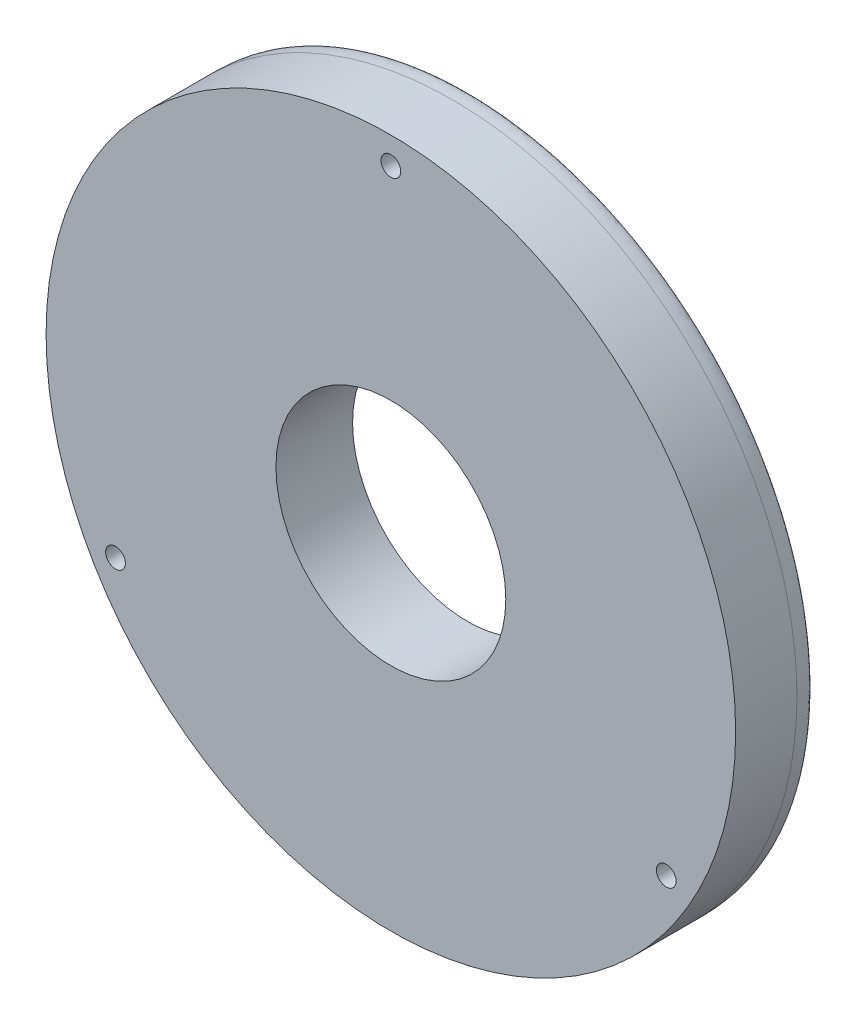
ISO-10303-21;
HEADER;
FILE_DESCRIPTION(('STEP AP214'),'2;1');
FILE_NAME('part.step','',(''),(''),'','','');
FILE_SCHEMA(('AUTOMOTIVE_DESIGN { 1 0 10303 214 1 1 1 1 }'));
ENDSEC;
DATA;
#1=APPLICATION_CONTEXT('core data for automotive mechanical design processes');
#2=APPLICATION_PROTOCOL_DEFINITION('international standard','automotive_design',2000,#1);
#3=PRODUCT_CONTEXT('',#1,'mechanical');
#4=PRODUCT('Part','Part','',(#3));
#5=PRODUCT_RELATED_PRODUCT_CATEGORY('part','',(#4));
#6=PRODUCT_DEFINITION_FORMATION('','',#4);
#7=PRODUCT_DEFINITION_CONTEXT('part definition',#1,'design');
#8=PRODUCT_DEFINITION('design','',#6,#7);
#9=PRODUCT_DEFINITION_SHAPE('','',#8);
#10=(LENGTH_UNIT() NAMED_UNIT(*) SI_UNIT(.MILLI.,.METRE.));
#11=(NAMED_UNIT(*) PLANE_ANGLE_UNIT() SI_UNIT($,.RADIAN.));
#12=(NAMED_UNIT(*) SI_UNIT($,.STERADIAN.) SOLID_ANGLE_UNIT());
#13=UNCERTAINTY_MEASURE_WITH_UNIT(LENGTH_MEASURE(1.E-05),#10,'distance_accuracy_value','');
#14=(GEOMETRIC_REPRESENTATION_CONTEXT(3) GLOBAL_UNCERTAINTY_ASSIGNED_CONTEXT((#13)) GLOBAL_UNIT_ASSIGNED_CONTEXT((#10,
#11,#12)) REPRESENTATION_CONTEXT('',''));
#15=CARTESIAN_POINT('',(0.,0.,0.));
#16=DIRECTION('',(0.,0.,1.));
#17=DIRECTION('',(1.,0.,0.));
#18=AXIS2_PLACEMENT_3D('',#15,#16,#17);
#19=CARTESIAN_POINT('',(0.,0.,25.4));
#20=DIRECTION('',(0.,0.,1.));
#21=DIRECTION('',(1.,0.,0.));
#22=AXIS2_PLACEMENT_3D('',#19,#20,#21);
#23=PLANE('',#22);
#24=CARTESIAN_POINT('',(-91.2877378129175,-52.7050000000004,25.4));
#25=DIRECTION('',(0.,0.,1.));
#26=DIRECTION('',(1.,0.,0.));
#27=AXIS2_PLACEMENT_3D('',#24,#25,#26);
#28=CIRCLE('',#27,3.26389999999999);
#29=CARTESIAN_POINT('',(-88.0238378129174,-52.7050000000004,25.4));
#30=VERTEX_POINT('',#29);
#31=EDGE_CURVE('E150',#30,#30,#28,.F.);
#32=ORIENTED_EDGE('',*,*,#31,.T.);
#33=EDGE_LOOP('',(#32));
#34=FACE_BOUND('',#33,.T.);
#35=CARTESIAN_POINT('',(0.,0.,25.4));
#36=DIRECTION('',(0.,0.,1.));
#37=DIRECTION('',(1.,0.,0.));
#38=AXIS2_PLACEMENT_3D('',#35,#36,#37);
#39=CIRCLE('',#38,114.3);
#40=CARTESIAN_POINT('',(114.3,0.,25.4));
#41=VERTEX_POINT('',#40);
#42=EDGE_CURVE('E64',#41,#41,#39,.T.);
#43=ORIENTED_EDGE('',*,*,#42,.T.);
#44=EDGE_LOOP('',(#43));
#45=FACE_BOUND('',#44,.T.);
#46=CARTESIAN_POINT('',(0.,0.,25.4));
#47=DIRECTION('',(0.,0.,1.));
#48=DIRECTION('',(1.,0.,0.));
#49=AXIS2_PLACEMENT_3D('',#46,#47,#48);
#50=CIRCLE('',#49,38.1);
#51=CARTESIAN_POINT('',(38.1,0.,25.4));
#52=VERTEX_POINT('',#51);
#53=EDGE_CURVE('E70',#52,#52,#50,.T.);
#54=ORIENTED_EDGE('',*,*,#53,.F.);
#55=EDGE_LOOP('',(#54));
#56=FACE_BOUND('',#55,.T.);
#57=CARTESIAN_POINT('',(0.,105.41,25.4));
#58=DIRECTION('',(0.,0.,1.));
#59=DIRECTION('',(1.,0.,0.));
#60=AXIS2_PLACEMENT_3D('',#57,#58,#59);
#61=CIRCLE('',#60,3.26389999999999);
#62=CARTESIAN_POINT('',(3.26389999999999,105.41,25.4));
#63=VERTEX_POINT('',#62);
#64=EDGE_CURVE('E133',#63,#63,#61,.F.);
#65=ORIENTED_EDGE('',*,*,#64,.T.);
#66=EDGE_LOOP('',(#65));
#67=FACE_BOUND('',#66,.T.);
#68=CARTESIAN_POINT('',(91.2877378129182,-52.7049999999992,25.4));
#69=DIRECTION('',(0.,0.,1.));
#70=DIRECTION('',(1.,0.,0.));
#71=AXIS2_PLACEMENT_3D('',#68,#69,#70);
#72=CIRCLE('',#71,3.26389999999999);
#73=CARTESIAN_POINT('',(94.5516378129182,-52.7049999999992,25.4));
#74=VERTEX_POINT('',#73);
#75=EDGE_CURVE('E160',#74,#74,#72,.F.);
#76=ORIENTED_EDGE('',*,*,#75,.T.);
#77=EDGE_LOOP('',(#76));
#78=FACE_BOUND('',#77,.T.);
#79=ADVANCED_FACE('F44',(#34,#45,#56,#67,#78),#23,.T.);
#80=CARTESIAN_POINT('',(0.,0.,25.4));
#81=DIRECTION('',(0.,0.,-1.));
#82=DIRECTION('',(-1.,0.,0.));
#83=AXIS2_PLACEMENT_3D('',#80,#81,#82);
#84=CYLINDRICAL_SURFACE('',#83,38.1);
#85=ORIENTED_EDGE('',*,*,#53,.T.);
#86=EDGE_LOOP('',(#85));
#87=FACE_BOUND('',#86,.T.);
#88=CARTESIAN_POINT('',(0.,0.,0.));
#89=DIRECTION('',(0.,0.,1.));
#90=DIRECTION('',(1.,0.,0.));
#91=AXIS2_PLACEMENT_3D('',#88,#89,#90);
#92=CIRCLE('',#91,38.1);
#93=CARTESIAN_POINT('',(38.1,0.,0.));
#94=VERTEX_POINT('',#93);
#95=EDGE_CURVE('E76',#94,#94,#92,.T.);
#96=ORIENTED_EDGE('',*,*,#95,.F.);
#97=EDGE_LOOP('',(#96));
#98=FACE_BOUND('',#97,.T.);
#99=ADVANCED_FACE('F98',(#87,#98),#84,.F.);
#100=CARTESIAN_POINT('',(0.,0.,25.4));
#101=DIRECTION('',(0.,0.,-1.));
#102=DIRECTION('',(-1.,0.,0.));
#103=AXIS2_PLACEMENT_3D('',#100,#101,#102);
#104=CYLINDRICAL_SURFACE('',#103,114.3);
#105=CARTESIAN_POINT('',(114.3,0.,5.08));
#106=CARTESIAN_POINT('',(114.3,-7.48091750654977,5.08));
#107=CARTESIAN_POINT('',(113.563212155357,-14.9616500324149,5.08));
#108=CARTESIAN_POINT('',(110.644302944821,-29.6359975804723,5.08));
#109=CARTESIAN_POINT('',(108.462253754573,-36.8292497508964,5.08));
#110=CARTESIAN_POINT('',(102.736607377507,-50.6521828877635,5.08));
#111=CARTESIAN_POINT('',(99.1931517683237,-57.281522055559,5.08));
#112=CARTESIAN_POINT('',(90.880801604038,-69.7218332127223,5.08));
#113=CARTESIAN_POINT('',(86.1121125877672,-75.5324975914777,5.08));
#114=CARTESIAN_POINT('',(75.5324975914772,-86.1121125877676,5.08));
#115=CARTESIAN_POINT('',(69.7218332127222,-90.8808016040381,5.08));
#116=CARTESIAN_POINT('',(57.2815220555588,-99.1931517683238,5.08));
#117=CARTESIAN_POINT('',(50.6521828877669,-102.736607377505,5.08));
#118=CARTESIAN_POINT('',(36.8292497508923,-108.462253754575,5.08));
#119=CARTESIAN_POINT('',(29.6359975804943,-110.644302944817,5.08));
#120=CARTESIAN_POINT('',(14.9616500323925,-113.563212155362,5.08));
#121=CARTESIAN_POINT('',(7.4809175062633,-114.3,5.08));
#122=CARTESIAN_POINT('',(-7.48091750626293,-114.3,5.08));
#123=CARTESIAN_POINT('',(-14.9616500324025,-113.56321215536,5.08));
#124=CARTESIAN_POINT('',(-29.6359975804847,-110.644302944819,5.08));
#125=CARTESIAN_POINT('',(-36.8292497508964,-108.462253754573,5.08));
#126=CARTESIAN_POINT('',(-50.6521828877635,-102.736607377507,5.08));
#127=CARTESIAN_POINT('',(-57.2815220555352,-99.1931517683395,5.08));
#128=CARTESIAN_POINT('',(-69.721833212746,-90.8808016040222,5.08));
#129=CARTESIAN_POINT('',(-75.5324975914941,-86.1121125877506,5.08));
#130=CARTESIAN_POINT('',(-86.1121125877505,-75.5324975914943,5.08));
#131=CARTESIAN_POINT('',(-90.8808016040193,-69.7218332127503,5.08));
#132=CARTESIAN_POINT('',(-99.1931517683426,-57.2815220555306,5.08));
#133=CARTESIAN_POINT('',(-102.736607377502,-50.6521828877746,5.08));
#134=CARTESIAN_POINT('',(-108.462253754578,-36.8292497508846,5.08));
#135=CARTESIAN_POINT('',(-110.644302944817,-29.6359975804947,5.08));
#136=CARTESIAN_POINT('',(-113.563212155362,-14.961650032392,5.08));
#137=CARTESIAN_POINT('',(-114.3,-7.4809175062631,5.08));
#138=CARTESIAN_POINT('',(-114.3,7.48091750626313,5.08));
#139=CARTESIAN_POINT('',(-113.56321215536,14.961650032402,5.08));
#140=CARTESIAN_POINT('',(-110.644302944819,29.6359975804851,5.08));
#141=CARTESIAN_POINT('',(-108.462253754584,36.8292497508705,5.08));
#142=CARTESIAN_POINT('',(-102.736607377496,50.6521828877893,5.08));
#143=CARTESIAN_POINT('',(-99.1931517683741,57.2815220554835,5.08));
#144=CARTESIAN_POINT('',(-90.8808016039876,69.7218332127977,5.08));
#145=CARTESIAN_POINT('',(-86.1121125877506,75.5324975914941,5.08));
#146=CARTESIAN_POINT('',(-75.5324975914943,86.1121125877505,5.08));
#147=CARTESIAN_POINT('',(-69.7218332127266,90.8808016040352,5.08));
#148=CARTESIAN_POINT('',(-57.2815220555544,99.1931517683268,5.08));
#149=CARTESIAN_POINT('',(-50.652182887771,102.736607377503,5.08));
#150=CARTESIAN_POINT('',(-36.8292497508886,108.462253754577,5.08));
#151=CARTESIAN_POINT('',(-29.6359975805071,110.644302944814,5.08));
#152=CARTESIAN_POINT('',(-14.9616500323797,113.563212155364,5.08));
#153=CARTESIAN_POINT('',(-7.4809175062631,114.3,5.08));
#154=CARTESIAN_POINT('',(7.48091750626311,114.3,5.08));
#155=CARTESIAN_POINT('',(14.9616500323922,113.563212155362,5.08));
#156=CARTESIAN_POINT('',(29.6359975804949,110.644302944817,5.08));
#157=CARTESIAN_POINT('',(36.8292497508885,108.462253754577,5.08));
#158=CARTESIAN_POINT('',(50.652182887771,102.736607377504,5.08));
#159=CARTESIAN_POINT('',(57.2815220555426,99.1931517683346,5.08));
#160=CARTESIAN_POINT('',(69.7218332127384,90.8808016040273,5.08));
#161=CARTESIAN_POINT('',(75.5324975914686,86.1121125877762,5.08));
#162=CARTESIAN_POINT('',(86.1121125877762,75.5324975914686,5.08));
#163=CARTESIAN_POINT('',(90.8808016040114,69.7218332127622,5.08));
#164=CARTESIAN_POINT('',(99.1931517683504,57.2815220555189,5.08));
#165=CARTESIAN_POINT('',(102.736607377505,50.6521828877673,5.08));
#166=CARTESIAN_POINT('',(108.462253754575,36.8292497508923,5.08));
#167=CARTESIAN_POINT('',(110.644302944819,29.6359975804825,5.08));
#168=CARTESIAN_POINT('',(113.563212155359,14.9616500324044,5.08));
#169=CARTESIAN_POINT('',(114.3,7.48091750654976,5.08));
#170=CARTESIAN_POINT('',(114.3,0.,5.08));
#171=(BOUNDED_CURVE() B_SPLINE_CURVE(3,(#105,#106,#107,#108,#109,#110,#111,#112,#113,#114,#115,
#116,#117,#118,#119,#120,#121,#122,#123,#124,#125,#126,#127,#128,#129,#130,#131,#132,#133,#134,
#135,#136,#137,#138,#139,#140,#141,#142,#143,#144,#145,#146,#147,#148,#149,#150,#151,#152,#153,
#154,#155,#156,#157,#158,#159,#160,#161,#162,#163,#164,#165,#166,#167,#168,#169,#170),
.UNSPECIFIED.,.T.,.F.) B_SPLINE_CURVE_WITH_KNOTS((4,2,2,2,2,2,2,2,2,2,2,2,2,2,2,2,2,2,2,2,2,2,2,
2,2,2,2,2,2,2,2,2,4),(0.,0.196349540849362,0.392699081698725,0.589048622548086,
0.785398163397448,0.981747704246811,1.17809724509617,1.37444678594553,1.5707963267949,
1.76714586764426,1.96349540849362,2.15984494934298,2.35619449019234,2.55254403104171,
2.74889357189107,2.94524311274043,3.14159265358979,3.33794219443916,3.53429173528852,
3.73064127613788,3.92699081698724,4.1233403578366,4.31968989868597,4.51603943953533,
4.71238898038469,4.90873852123405,5.10508806208341,5.30143760293278,5.49778714378214,
5.6941366846315,5.89048622548086,6.08683576633022,6.28318530717959),
.UNSPECIFIED.) CURVE() GEOMETRIC_REPRESENTATION_ITEM() RATIONAL_B_SPLINE_CURVE((1.,1.,1.,1.,1.,
1.,1.,1.,1.,1.,1.,1.,1.,1.,1.,1.,1.,1.,1.,1.,1.,1.,1.,1.,1.,1.,1.,1.,1.,1.,1.,1.,1.,1.,1.,1.,1.,
1.,1.,1.,1.,1.,1.,1.,1.,1.,1.,1.,1.,1.,1.,1.,1.,1.,1.,1.,1.,1.,1.,1.,1.,1.,1.,1.,1.,1.)) REPRESENTATION_ITEM(''));
#172=CARTESIAN_POINT('',(114.3,0.,5.08));
#173=VERTEX_POINT('',#172);
#174=EDGE_CURVE('E58',#173,#173,#171,.F.);
#175=ORIENTED_EDGE('',*,*,#174,.T.);
#176=EDGE_LOOP('',(#175));
#177=FACE_BOUND('',#176,.T.);
#178=ORIENTED_EDGE('',*,*,#42,.F.);
#179=EDGE_LOOP('',(#178));
#180=FACE_BOUND('',#179,.T.);
#181=ADVANCED_FACE('F88',(#177,#180),#104,.T.);
#182=CARTESIAN_POINT('',(0.,0.,0.));
#183=DIRECTION('',(0.,0.,1.));
#184=DIRECTION('',(1.,0.,0.));
#185=AXIS2_PLACEMENT_3D('',#182,#183,#184);
#186=PLANE('',#185);
#187=CARTESIAN_POINT('',(113.03,0.,0.));
#188=CARTESIAN_POINT('',(113.03,7.39779620092143,0.));
#189=CARTESIAN_POINT('',(112.301398686983,14.7954094764781,0.));
#190=CARTESIAN_POINT('',(109.414921800971,29.3067087184879,0.));
#191=CARTESIAN_POINT('',(107.257117601799,36.4200358647872,0.));
#192=CARTESIAN_POINT('',(101.595089517703,50.089380855665,0.));
#193=CARTESIAN_POINT('',(98.0910056375857,56.6450606993489,0.));
#194=CARTESIAN_POINT('',(89.8710149195277,68.9471461770625,0.));
#195=CARTESIAN_POINT('',(85.1553113368249,74.6932476182061,0.));
#196=CARTESIAN_POINT('',(74.6932476182061,85.1553113368249,0.));
#197=CARTESIAN_POINT('',(68.9471461770624,89.871014919579,0.));
#198=CARTESIAN_POINT('',(56.6450606993489,98.0910056375344,0.));
#199=CARTESIAN_POINT('',(50.0893808556906,101.595089517754,0.));
#200=CARTESIAN_POINT('',(36.4200358647615,107.257117601747,0.));
#201=CARTESIAN_POINT('',(29.306708718488,109.414921800971,0.));
#202=CARTESIAN_POINT('',(14.7954094764782,112.301398686983,0.));
#203=CARTESIAN_POINT('',(7.39779620063797,113.03,0.));
#204=CARTESIAN_POINT('',(-7.39779620063795,113.03,0.));
#205=CARTESIAN_POINT('',(-14.7954094764652,112.301398686983,0.));
#206=CARTESIAN_POINT('',(-29.3067087185006,109.414921800971,0.));
#207=CARTESIAN_POINT('',(-36.4200358647616,107.257117601747,0.));
#208=CARTESIAN_POINT('',(-50.0893808556907,101.595089517754,0.));
#209=CARTESIAN_POINT('',(-56.6450606994002,98.0910056375858,0.));
#210=CARTESIAN_POINT('',(-68.947146177011,89.8710149195277,0.));
#211=CARTESIAN_POINT('',(-74.6932476182574,85.1553113368248,0.));
#212=CARTESIAN_POINT('',(-85.1553113367736,74.693247618206,0.));
#213=CARTESIAN_POINT('',(-89.8710149195276,68.9471461771138,0.));
#214=CARTESIAN_POINT('',(-98.0910056375857,56.6450606992976,0.));
#215=CARTESIAN_POINT('',(-101.595089517703,50.0893808556908,0.));
#216=CARTESIAN_POINT('',(-107.257117601798,36.4200358647617,0.));
#217=CARTESIAN_POINT('',(-109.414921801023,29.306708718488,0.));
#218=CARTESIAN_POINT('',(-112.301398686932,14.7954094764782,0.));
#219=CARTESIAN_POINT('',(-113.03,7.39779620063798,0.));
#220=CARTESIAN_POINT('',(-113.03,-7.39779620063795,0.));
#221=CARTESIAN_POINT('',(-112.301398686983,-14.795409476478,0.));
#222=CARTESIAN_POINT('',(-109.414921800971,-29.3067087184878,0.));
#223=CARTESIAN_POINT('',(-107.257117601696,-36.4200358647614,0.));
#224=CARTESIAN_POINT('',(-101.595089517806,-50.0893808556905,0.));
#225=CARTESIAN_POINT('',(-98.0910056376371,-56.6450606994001,0.));
#226=CARTESIAN_POINT('',(-89.8710149194764,-68.947146177011,0.));
#227=CARTESIAN_POINT('',(-85.1553113368248,-74.6932476182574,0.));
#228=CARTESIAN_POINT('',(-74.693247618206,-85.1553113367736,0.));
#229=CARTESIAN_POINT('',(-68.9471461770104,-89.8710149194772,0.));
#230=CARTESIAN_POINT('',(-56.6450606994011,-98.091005637636,0.));
#231=CARTESIAN_POINT('',(-50.0893808556814,-101.595089517742,0.));
#232=CARTESIAN_POINT('',(-36.4200358647711,-107.257117601759,0.));
#233=CARTESIAN_POINT('',(-29.306708718496,-109.414921801044,0.));
#234=CARTESIAN_POINT('',(-14.7954094764703,-112.301398686911,0.));
#235=CARTESIAN_POINT('',(-7.39779620063779,-113.03,0.));
#236=CARTESIAN_POINT('',(7.39779620063815,-113.03,0.));
#237=CARTESIAN_POINT('',(14.79540947647,-112.301398686962,0.));
#238=CARTESIAN_POINT('',(29.3067087184958,-109.414921800992,0.));
#239=CARTESIAN_POINT('',(36.4200358647708,-107.257117601708,0.));
#240=CARTESIAN_POINT('',(50.089380855681,-101.595089517794,0.));
#241=CARTESIAN_POINT('',(56.6450606994009,-98.0910056375848,0.));
#242=CARTESIAN_POINT('',(68.9471461770103,-89.8710149195286,0.));
#243=CARTESIAN_POINT('',(74.6932476182631,-85.1553113368192,0.));
#244=CARTESIAN_POINT('',(85.1553113367674,-74.6932476182122,0.));
#245=CARTESIAN_POINT('',(89.8710149195286,-68.9471461770104,0.));
#246=CARTESIAN_POINT('',(98.0910056375847,-56.6450606994011,0.));
#247=CARTESIAN_POINT('',(101.595089517742,-50.0893808556814,0.));
#248=CARTESIAN_POINT('',(107.257117601759,-36.4200358647711,0.));
#249=CARTESIAN_POINT('',(109.414921801044,-29.3067087184832,0.));
#250=CARTESIAN_POINT('',(112.301398686911,-14.7954094764831,0.));
#251=CARTESIAN_POINT('',(113.03,-7.39779620092144,0.));
#252=CARTESIAN_POINT('',(113.03,0.,0.));
#253=(BOUNDED_CURVE() B_SPLINE_CURVE(3,(#187,#188,#189,#190,#191,#192,#193,#194,#195,#196,#197,
#198,#199,#200,#201,#202,#203,#204,#205,#206,#207,#208,#209,#210,#211,#212,#213,#214,#215,#216,
#217,#218,#219,#220,#221,#222,#223,#224,#225,#226,#227,#228,#229,#230,#231,#232,#233,#234,#235,
#236,#237,#238,#239,#240,#241,#242,#243,#244,#245,#246,#247,#248,#249,#250,#251,#252),
.UNSPECIFIED.,.T.,.F.) B_SPLINE_CURVE_WITH_KNOTS((4,2,2,2,2,2,2,2,2,2,2,2,2,2,2,2,2,2,2,2,2,2,2,
2,2,2,2,2,2,2,2,2,4),(0.,0.196349540849362,0.392699081698724,0.589048622548086,
0.785398163397448,0.98174770424681,1.17809724509617,1.37444678594553,1.5707963267949,
1.76714586764426,1.96349540849362,2.15984494934298,2.35619449019234,2.55254403104171,
2.74889357189107,2.94524311274043,3.14159265358979,3.33794219443916,3.53429173528852,
3.73064127613788,3.92699081698724,4.1233403578366,4.31968989868597,4.51603943953533,
4.71238898038469,4.90873852123405,5.10508806208341,5.30143760293278,5.49778714378214,
5.6941366846315,5.89048622548086,6.08683576633022,6.28318530717959),
.UNSPECIFIED.) CURVE() GEOMETRIC_REPRESENTATION_ITEM() RATIONAL_B_SPLINE_CURVE((1.,1.,1.,1.,1.,
1.,1.,1.,1.,1.,1.,1.,1.,1.,1.,1.,1.,1.,1.,1.,1.,1.,1.,1.,1.,1.,1.,1.,1.,1.,1.,1.,1.,1.,1.,1.,1.,
1.,1.,1.,1.,1.,1.,1.,1.,1.,1.,1.,1.,1.,1.,1.,1.,1.,1.,1.,1.,1.,1.,1.,1.,1.,1.,1.,1.,1.)) REPRESENTATION_ITEM(''));
#254=CARTESIAN_POINT('',(113.03,0.,0.));
#255=VERTEX_POINT('',#254);
#256=EDGE_CURVE('E11',#255,#255,#253,.F.);
#257=ORIENTED_EDGE('',*,*,#256,.T.);
#258=EDGE_LOOP('',(#257));
#259=FACE_BOUND('',#258,.T.);
#260=CARTESIAN_POINT('',(91.2877378129182,-52.7049999999992,0.));
#261=DIRECTION('',(0.,0.,-1.));
#262=DIRECTION('',(-1.,0.,0.));
#263=AXIS2_PLACEMENT_3D('',#260,#261,#262);
#264=CIRCLE('',#263,5.55625);
#265=CARTESIAN_POINT('',(85.7314878129182,-52.7049999999992,0.));
#266=VERTEX_POINT('',#265);
#267=EDGE_CURVE('E123',#266,#266,#264,.T.);
#268=ORIENTED_EDGE('',*,*,#267,.F.);
#269=EDGE_LOOP('',(#268));
#270=FACE_BOUND('',#269,.T.);
#271=CARTESIAN_POINT('',(-91.2877378129175,-52.7050000000004,0.));
#272=DIRECTION('',(0.,0.,-1.));
#273=DIRECTION('',(-1.,0.,0.));
#274=AXIS2_PLACEMENT_3D('',#271,#272,#273);
#275=CIRCLE('',#274,5.55625);
#276=CARTESIAN_POINT('',(-96.8439878129174,-52.7050000000004,0.));
#277=VERTEX_POINT('',#276);
#278=EDGE_CURVE('E127',#277,#277,#275,.T.);
#279=ORIENTED_EDGE('',*,*,#278,.F.);
#280=EDGE_LOOP('',(#279));
#281=FACE_BOUND('',#280,.T.);
#282=CARTESIAN_POINT('',(0.,105.41,0.));
#283=DIRECTION('',(0.,0.,-1.));
#284=DIRECTION('',(-1.,0.,0.));
#285=AXIS2_PLACEMENT_3D('',#282,#283,#284);
#286=CIRCLE('',#285,5.55625);
#287=CARTESIAN_POINT('',(-5.55625,105.41,0.));
#288=VERTEX_POINT('',#287);
#289=EDGE_CURVE('E130',#288,#288,#286,.T.);
#290=ORIENTED_EDGE('',*,*,#289,.F.);
#291=EDGE_LOOP('',(#290));
#292=FACE_BOUND('',#291,.T.);
#293=ORIENTED_EDGE('',*,*,#95,.T.);
#294=EDGE_LOOP('',(#293));
#295=FACE_BOUND('',#294,.T.);
#296=ADVANCED_FACE('F97',(#259,#270,#281,#292,#295),#186,.F.);
#297=CARTESIAN_POINT('',(0.,105.41,0.));
#298=DIRECTION('',(0.,0.,-1.));
#299=DIRECTION('',(-1.,0.,0.));
#300=AXIS2_PLACEMENT_3D('',#297,#298,#299);
#301=CYLINDRICAL_SURFACE('',#300,3.26389999999999);
#302=ORIENTED_EDGE('',*,*,#64,.F.);
#303=EDGE_LOOP('',(#302));
#304=FACE_BOUND('',#303,.T.);
#305=CARTESIAN_POINT('',(0.,105.41,6.34999999999999));
#306=DIRECTION('',(0.,0.,-1.));
#307=DIRECTION('',(-1.,0.,0.));
#308=AXIS2_PLACEMENT_3D('',#305,#306,#307);
#309=CIRCLE('',#308,3.26389999999999);
#310=CARTESIAN_POINT('',(-3.26389999999999,105.41,6.34999999999999));
#311=VERTEX_POINT('',#310);
#312=EDGE_CURVE('E139',#311,#311,#309,.T.);
#313=ORIENTED_EDGE('',*,*,#312,.T.);
#314=EDGE_LOOP('',(#313));
#315=FACE_BOUND('',#314,.T.);
#316=ADVANCED_FACE('F112',(#304,#315),#301,.F.);
#317=CARTESIAN_POINT('',(3.26389999999999,105.41,6.35));
#318=DIRECTION('',(0.,0.,1.));
#319=DIRECTION('',(1.,0.,0.));
#320=AXIS2_PLACEMENT_3D('',#317,#318,#319);
#321=PLANE('',#320);
#322=ORIENTED_EDGE('',*,*,#312,.F.);
#323=EDGE_LOOP('',(#322));
#324=FACE_BOUND('',#323,.T.);
#325=CARTESIAN_POINT('',(0.,105.41,6.35));
#326=DIRECTION('',(0.,0.,-1.));
#327=DIRECTION('',(-1.,0.,0.));
#328=AXIS2_PLACEMENT_3D('',#325,#326,#327);
#329=CIRCLE('',#328,5.55625);
#330=CARTESIAN_POINT('',(-5.55625,105.41,6.35));
#331=VERTEX_POINT('',#330);
#332=EDGE_CURVE('E82',#331,#331,#329,.T.);
#333=ORIENTED_EDGE('',*,*,#332,.T.);
#334=EDGE_LOOP('',(#333));
#335=FACE_BOUND('',#334,.T.);
#336=ADVANCED_FACE('F116',(#324,#335),#321,.F.);
#337=CARTESIAN_POINT('',(0.,105.41,0.));
#338=DIRECTION('',(0.,0.,-1.));
#339=DIRECTION('',(-1.,0.,0.));
#340=AXIS2_PLACEMENT_3D('',#337,#338,#339);
#341=CYLINDRICAL_SURFACE('',#340,5.55625);
#342=ORIENTED_EDGE('',*,*,#332,.F.);
#343=EDGE_LOOP('',(#342));
#344=FACE_BOUND('',#343,.T.);
#345=ORIENTED_EDGE('',*,*,#289,.T.);
#346=EDGE_LOOP('',(#345));
#347=FACE_BOUND('',#346,.T.);
#348=ADVANCED_FACE('F196',(#344,#347),#341,.F.);
#349=CARTESIAN_POINT('',(-91.2877378129175,-52.7050000000004,0.));
#350=DIRECTION('',(0.,0.,-1.));
#351=DIRECTION('',(-1.,0.,0.));
#352=AXIS2_PLACEMENT_3D('',#349,#350,#351);
#353=CYLINDRICAL_SURFACE('',#352,3.26389999999999);
#354=ORIENTED_EDGE('',*,*,#31,.F.);
#355=EDGE_LOOP('',(#354));
#356=FACE_BOUND('',#355,.T.);
#357=CARTESIAN_POINT('',(-91.2877378129175,-52.7050000000004,6.34999999999999));
#358=DIRECTION('',(0.,0.,-1.));
#359=DIRECTION('',(-1.,0.,0.));
#360=AXIS2_PLACEMENT_3D('',#357,#358,#359);
#361=CIRCLE('',#360,3.26389999999999);
#362=CARTESIAN_POINT('',(-94.5516378129174,-52.7050000000004,6.34999999999999));
#363=VERTEX_POINT('',#362);
#364=EDGE_CURVE('E141',#363,#363,#361,.T.);
#365=ORIENTED_EDGE('',*,*,#364,.T.);
#366=EDGE_LOOP('',(#365));
#367=FACE_BOUND('',#366,.T.);
#368=ADVANCED_FACE('F192',(#356,#367),#353,.F.);
#369=CARTESIAN_POINT('',(-88.0238378129175,-52.7050000000004,6.35));
#370=DIRECTION('',(0.,0.,1.));
#371=DIRECTION('',(1.,0.,0.));
#372=AXIS2_PLACEMENT_3D('',#369,#370,#371);
#373=PLANE('',#372);
#374=ORIENTED_EDGE('',*,*,#364,.F.);
#375=EDGE_LOOP('',(#374));
#376=FACE_BOUND('',#375,.T.);
#377=CARTESIAN_POINT('',(-91.2877378129175,-52.7050000000004,6.35));
#378=DIRECTION('',(0.,0.,-1.));
#379=DIRECTION('',(-1.,0.,0.));
#380=AXIS2_PLACEMENT_3D('',#377,#378,#379);
#381=CIRCLE('',#380,5.55625);
#382=CARTESIAN_POINT('',(-96.8439878129174,-52.7050000000004,6.35));
#383=VERTEX_POINT('',#382);
#384=EDGE_CURVE('E134',#383,#383,#381,.T.);
#385=ORIENTED_EDGE('',*,*,#384,.T.);
#386=EDGE_LOOP('',(#385));
#387=FACE_BOUND('',#386,.T.);
#388=ADVANCED_FACE('F195',(#376,#387),#373,.F.);
#389=CARTESIAN_POINT('',(-91.2877378129175,-52.7050000000004,0.));
#390=DIRECTION('',(0.,0.,-1.));
#391=DIRECTION('',(-1.,0.,0.));
#392=AXIS2_PLACEMENT_3D('',#389,#390,#391);
#393=CYLINDRICAL_SURFACE('',#392,5.55625);
#394=ORIENTED_EDGE('',*,*,#384,.F.);
#395=EDGE_LOOP('',(#394));
#396=FACE_BOUND('',#395,.T.);
#397=ORIENTED_EDGE('',*,*,#278,.T.);
#398=EDGE_LOOP('',(#397));
#399=FACE_BOUND('',#398,.T.);
#400=ADVANCED_FACE('F200',(#396,#399),#393,.F.);
#401=CARTESIAN_POINT('',(91.2877378129182,-52.7049999999992,0.));
#402=DIRECTION('',(0.,0.,-1.));
#403=DIRECTION('',(-1.,0.,0.));
#404=AXIS2_PLACEMENT_3D('',#401,#402,#403);
#405=CYLINDRICAL_SURFACE('',#404,3.26389999999999);
#406=ORIENTED_EDGE('',*,*,#75,.F.);
#407=EDGE_LOOP('',(#406));
#408=FACE_BOUND('',#407,.T.);
#409=CARTESIAN_POINT('',(91.2877378129182,-52.7049999999992,6.34999999999999));
#410=DIRECTION('',(0.,0.,-1.));
#411=DIRECTION('',(-1.,0.,0.));
#412=AXIS2_PLACEMENT_3D('',#409,#410,#411);
#413=CIRCLE('',#412,3.26389999999999);
#414=CARTESIAN_POINT('',(88.0238378129182,-52.7049999999992,6.34999999999999));
#415=VERTEX_POINT('',#414);
#416=EDGE_CURVE('E164',#415,#415,#413,.T.);
#417=ORIENTED_EDGE('',*,*,#416,.T.);
#418=EDGE_LOOP('',(#417));
#419=FACE_BOUND('',#418,.T.);
#420=ADVANCED_FACE('F174',(#408,#419),#405,.F.);
#421=CARTESIAN_POINT('',(94.5516378129182,-52.7049999999992,6.35));
#422=DIRECTION('',(0.,0.,1.));
#423=DIRECTION('',(1.,0.,0.));
#424=AXIS2_PLACEMENT_3D('',#421,#422,#423);
#425=PLANE('',#424);
#426=ORIENTED_EDGE('',*,*,#416,.F.);
#427=EDGE_LOOP('',(#426));
#428=FACE_BOUND('',#427,.T.);
#429=CARTESIAN_POINT('',(91.2877378129182,-52.7049999999992,6.35));
#430=DIRECTION('',(0.,0.,-1.));
#431=DIRECTION('',(-1.,0.,0.));
#432=AXIS2_PLACEMENT_3D('',#429,#430,#431);
#433=CIRCLE('',#432,5.55625);
#434=CARTESIAN_POINT('',(85.7314878129182,-52.7049999999992,6.35));
#435=VERTEX_POINT('',#434);
#436=EDGE_CURVE('E155',#435,#435,#433,.T.);
#437=ORIENTED_EDGE('',*,*,#436,.T.);
#438=EDGE_LOOP('',(#437));
#439=FACE_BOUND('',#438,.T.);
#440=ADVANCED_FACE('F176',(#428,#439),#425,.F.);
#441=CARTESIAN_POINT('',(91.2877378129182,-52.7049999999992,0.));
#442=DIRECTION('',(0.,0.,-1.));
#443=DIRECTION('',(-1.,0.,0.));
#444=AXIS2_PLACEMENT_3D('',#441,#442,#443);
#445=CYLINDRICAL_SURFACE('',#444,5.55625);
#446=ORIENTED_EDGE('',*,*,#436,.F.);
#447=EDGE_LOOP('',(#446));
#448=FACE_BOUND('',#447,.T.);
#449=ORIENTED_EDGE('',*,*,#267,.T.);
#450=EDGE_LOOP('',(#449));
#451=FACE_BOUND('',#450,.T.);
#452=ADVANCED_FACE('F179',(#448,#451),#445,.F.);
#453=CARTESIAN_POINT('',(114.3,0.,5.08));
#454=CARTESIAN_POINT('',(114.3,7.48091750654976,5.08));
#455=CARTESIAN_POINT('',(113.563212155359,14.9616500324044,5.08));
#456=CARTESIAN_POINT('',(110.644302944819,29.6359975804825,5.08));
#457=CARTESIAN_POINT('',(108.462253754575,36.8292497508923,5.08));
#458=CARTESIAN_POINT('',(102.736607377505,50.6521828877673,5.08));
#459=CARTESIAN_POINT('',(99.1931517683504,57.2815220555189,5.08));
#460=CARTESIAN_POINT('',(90.8808016040114,69.7218332127622,5.08));
#461=CARTESIAN_POINT('',(86.1121125877762,75.5324975914686,5.08));
#462=CARTESIAN_POINT('',(75.5324975914686,86.1121125877762,5.08));
#463=CARTESIAN_POINT('',(69.7218332127384,90.8808016040273,5.08));
#464=CARTESIAN_POINT('',(57.2815220555426,99.1931517683346,5.08));
#465=CARTESIAN_POINT('',(50.652182887771,102.736607377504,5.08));
#466=CARTESIAN_POINT('',(36.8292497508885,108.462253754577,5.08));
#467=CARTESIAN_POINT('',(29.6359975804949,110.644302944817,5.08));
#468=CARTESIAN_POINT('',(14.9616500323922,113.563212155362,5.08));
#469=CARTESIAN_POINT('',(7.48091750626311,114.3,5.08));
#470=CARTESIAN_POINT('',(-7.4809175062631,114.3,5.08));
#471=CARTESIAN_POINT('',(-14.9616500323797,113.563212155364,5.08));
#472=CARTESIAN_POINT('',(-29.6359975805071,110.644302944814,5.08));
#473=CARTESIAN_POINT('',(-36.8292497508886,108.462253754577,5.08));
#474=CARTESIAN_POINT('',(-50.652182887771,102.736607377503,5.08));
#475=CARTESIAN_POINT('',(-57.2815220555544,99.1931517683268,5.08));
#476=CARTESIAN_POINT('',(-69.7218332127266,90.8808016040352,5.08));
#477=CARTESIAN_POINT('',(-75.5324975914943,86.1121125877505,5.08));
#478=CARTESIAN_POINT('',(-86.1121125877506,75.5324975914941,5.08));
#479=CARTESIAN_POINT('',(-90.8808016039876,69.7218332127977,5.08));
#480=CARTESIAN_POINT('',(-99.1931517683741,57.2815220554835,5.08));
#481=CARTESIAN_POINT('',(-102.736607377496,50.6521828877893,5.08));
#482=CARTESIAN_POINT('',(-108.462253754584,36.8292497508705,5.08));
#483=CARTESIAN_POINT('',(-110.644302944819,29.6359975804851,5.08));
#484=CARTESIAN_POINT('',(-113.56321215536,14.961650032402,5.08));
#485=CARTESIAN_POINT('',(-114.3,7.48091750626313,5.08));
#486=CARTESIAN_POINT('',(-114.3,-7.4809175062631,5.08));
#487=CARTESIAN_POINT('',(-113.563212155362,-14.961650032392,5.08));
#488=CARTESIAN_POINT('',(-110.644302944817,-29.6359975804947,5.08));
#489=CARTESIAN_POINT('',(-108.462253754578,-36.8292497508846,5.08));
#490=CARTESIAN_POINT('',(-102.736607377502,-50.6521828877746,5.08));
#491=CARTESIAN_POINT('',(-99.1931517683426,-57.2815220555306,5.08));
#492=CARTESIAN_POINT('',(-90.8808016040193,-69.7218332127503,5.08));
#493=CARTESIAN_POINT('',(-86.1121125877505,-75.5324975914943,5.08));
#494=CARTESIAN_POINT('',(-75.5324975914941,-86.1121125877506,5.08));
#495=CARTESIAN_POINT('',(-69.721833212746,-90.8808016040222,5.08));
#496=CARTESIAN_POINT('',(-57.2815220555352,-99.1931517683395,5.08));
#497=CARTESIAN_POINT('',(-50.6521828877635,-102.736607377507,5.08));
#498=CARTESIAN_POINT('',(-36.8292497508964,-108.462253754573,5.08));
#499=CARTESIAN_POINT('',(-29.6359975804847,-110.644302944819,5.08));
#500=CARTESIAN_POINT('',(-14.9616500324025,-113.56321215536,5.08));
#501=CARTESIAN_POINT('',(-7.48091750626293,-114.3,5.08));
#502=CARTESIAN_POINT('',(7.4809175062633,-114.3,5.08));
#503=CARTESIAN_POINT('',(14.9616500323925,-113.563212155362,5.08));
#504=CARTESIAN_POINT('',(29.6359975804943,-110.644302944817,5.08));
#505=CARTESIAN_POINT('',(36.8292497508923,-108.462253754575,5.08));
#506=CARTESIAN_POINT('',(50.6521828877669,-102.736607377505,5.08));
#507=CARTESIAN_POINT('',(57.2815220555588,-99.1931517683238,5.08));
#508=CARTESIAN_POINT('',(69.7218332127222,-90.8808016040381,5.08));
#509=CARTESIAN_POINT('',(75.5324975914772,-86.1121125877676,5.08));
#510=CARTESIAN_POINT('',(86.1121125877672,-75.5324975914777,5.08));
#511=CARTESIAN_POINT('',(90.880801604038,-69.7218332127223,5.08));
#512=CARTESIAN_POINT('',(99.1931517683237,-57.281522055559,5.08));
#513=CARTESIAN_POINT('',(102.736607377507,-50.6521828877635,5.08));
#514=CARTESIAN_POINT('',(108.462253754573,-36.8292497508964,5.08));
#515=CARTESIAN_POINT('',(110.644302944821,-29.6359975804723,5.08));
#516=CARTESIAN_POINT('',(113.563212155357,-14.9616500324149,5.08));
#517=CARTESIAN_POINT('',(114.3,-7.48091750654977,5.08));
#518=CARTESIAN_POINT('',(114.3,0.,5.08));
#519=CARTESIAN_POINT('',(114.3,0.,0.));
#520=CARTESIAN_POINT('',(114.3,7.48091750654976,0.));
#521=CARTESIAN_POINT('',(113.563212155364,14.9616500324182,-1.28322633781841E-11));
#522=CARTESIAN_POINT('',(110.644302944814,29.6359975804687,1.283399810166E-11));
#523=CARTESIAN_POINT('',(108.462253754616,36.829249750935,-6.41569800822304E-12));
#524=CARTESIAN_POINT('',(102.736607377464,50.6521828877246,6.41743273169902E-12));
#525=CARTESIAN_POINT('',(99.1931517683463,57.2815220555162,1.92505634716211E-11));
#526=CARTESIAN_POINT('',(90.8808016040156,69.721833212765,-1.92488287481451E-11));
#527=CARTESIAN_POINT('',(86.1121125877762,75.5324975914686,0.));
#528=CARTESIAN_POINT('',(75.5324975914686,86.1121125877762,0.));
#529=CARTESIAN_POINT('',(69.7218332127649,90.8808016040669,0.));
#530=CARTESIAN_POINT('',(57.2815220555161,99.193151768295,0.));
#531=CARTESIAN_POINT('',(50.6521828877245,102.736607377515,2.56671288415821E-11));
#532=CARTESIAN_POINT('',(36.8292497509349,108.462253754565,-2.56653941181061E-11));
#533=CARTESIAN_POINT('',(29.6359975804945,110.644302944814,-1.60405460631646E-11));
#534=CARTESIAN_POINT('',(14.9616500323926,113.563212155364,1.60422807866406E-11));
#535=CARTESIAN_POINT('',(7.48091750626311,114.3,0.));
#536=CARTESIAN_POINT('',(-7.4809175062631,114.3,0.));
#537=CARTESIAN_POINT('',(-14.9616500323796,113.563212155364,3.2091500467185E-12));
#538=CARTESIAN_POINT('',(-29.6359975805071,110.644302944815,-3.20741532324252E-12));
#539=CARTESIAN_POINT('',(-36.8292497508837,108.462253754565,-3.20654796150454E-12));
#540=CARTESIAN_POINT('',(-50.6521828877759,102.736607377515,3.21001740845649E-12));
#541=CARTESIAN_POINT('',(-57.2815220555674,99.1931517683463,-1.60405460631646E-11));
#542=CARTESIAN_POINT('',(-69.7218332127135,90.8808016040156,1.60422807866406E-11));
#543=CARTESIAN_POINT('',(-75.5324975915199,86.1121125877762,0.));
#544=CARTESIAN_POINT('',(-86.112112587725,75.5324975914685,0.));
#545=CARTESIAN_POINT('',(-90.8808016040155,69.7218332128163,-6.41569800822304E-12));
#546=CARTESIAN_POINT('',(-99.1931517683462,57.2815220554649,6.41743273169901E-12));
#547=CARTESIAN_POINT('',(-102.736607377464,50.652182887776,0.));
#548=CARTESIAN_POINT('',(-108.462253754616,36.8292497508838,0.));
#549=CARTESIAN_POINT('',(-110.644302944866,29.6359975804945,-6.41569800822303E-12));
#550=CARTESIAN_POINT('',(-113.563212155313,14.9616500323926,6.41743273169902E-12));
#551=CARTESIAN_POINT('',(-114.3,7.48091750626313,0.));
#552=CARTESIAN_POINT('',(-114.3,-7.4809175062631,0.));
#553=CARTESIAN_POINT('',(-113.563212155364,-14.9616500324053,0.));
#554=CARTESIAN_POINT('',(-110.644302944815,-29.6359975804814,0.));
#555=CARTESIAN_POINT('',(-108.462253754514,-36.8292497508322,1.28305286547081E-11));
#556=CARTESIAN_POINT('',(-102.736607377567,-50.6521828878271,-1.2835732825136E-11));
#557=CARTESIAN_POINT('',(-99.1931517683977,-57.2815220555674,-9.62311333146555E-12));
#558=CARTESIAN_POINT('',(-90.8808016039643,-69.7218332127135,9.62658277841752E-12));
#559=CARTESIAN_POINT('',(-86.1121125877762,-75.5324975915199,0.));
#560=CARTESIAN_POINT('',(-75.5324975914685,-86.112112587725,0.));
#561=CARTESIAN_POINT('',(-69.7218332127095,-90.8808016039675,-6.41569800790097E-12));
#562=CARTESIAN_POINT('',(-57.2815220555718,-99.1931517683943,6.41743273137691E-12));
#563=CARTESIAN_POINT('',(-50.6521828877884,-102.736607377505,-1.28322633775399E-11));
#564=CARTESIAN_POINT('',(-36.8292497508714,-108.462253754575,1.28339981010159E-11));
#565=CARTESIAN_POINT('',(-29.6359975805112,-110.644302944888,-3.21088477003344E-12));
#566=CARTESIAN_POINT('',(-14.961650032376,-113.563212155291,3.20568059960551E-12));
#567=CARTESIAN_POINT('',(-7.48091750626293,-114.3,0.));
#568=CARTESIAN_POINT('',(7.4809175062633,-114.3,0.));
#569=CARTESIAN_POINT('',(14.9616500323886,-113.563212155342,-6.413095922687E-12));
#570=CARTESIAN_POINT('',(29.6359975804981,-110.644302944836,6.42003481659091E-12));
#571=CARTESIAN_POINT('',(36.8292497508711,-108.462253754524,-6.41916745485291E-12));
#572=CARTESIAN_POINT('',(50.6521828877881,-102.736607377556,6.41396328442495E-12));
#573=CARTESIAN_POINT('',(57.2815220555717,-99.193151768343,-3.20828268481946E-12));
#574=CARTESIAN_POINT('',(69.7218332127093,-90.8808016040189,3.20828268481948E-12));
#575=CARTESIAN_POINT('',(75.5324975914772,-86.1121125877676,0.));
#576=CARTESIAN_POINT('',(86.1121125877671,-75.5324975914777,0.));
#577=CARTESIAN_POINT('',(90.8808016040188,-69.7218332127095,0.));
#578=CARTESIAN_POINT('',(99.1931517683429,-57.2815220555718,0.));
#579=CARTESIAN_POINT('',(102.736607377505,-50.6521828877884,-1.92488287471788E-11));
#580=CARTESIAN_POINT('',(108.462253754575,-36.8292497508714,1.92505634706548E-11));
#581=CARTESIAN_POINT('',(110.644302944888,-29.6359975804856,0.));
#582=CARTESIAN_POINT('',(113.563212155291,-14.9616500324017,0.));
#583=CARTESIAN_POINT('',(114.3,-7.48091750654977,0.));
#584=CARTESIAN_POINT('',(114.3,0.,0.));
#585=CARTESIAN_POINT('',(113.03,0.,0.));
#586=CARTESIAN_POINT('',(113.03,7.39779620092143,0.));
#587=CARTESIAN_POINT('',(112.301398686983,14.7954094764781,0.));
#588=CARTESIAN_POINT('',(109.414921800971,29.3067087184879,0.));
#589=CARTESIAN_POINT('',(107.257117601799,36.4200358647872,0.));
#590=CARTESIAN_POINT('',(101.595089517703,50.089380855665,0.));
#591=CARTESIAN_POINT('',(98.0910056375857,56.6450606993489,0.));
#592=CARTESIAN_POINT('',(89.8710149195277,68.9471461770625,0.));
#593=CARTESIAN_POINT('',(85.1553113368249,74.6932476182061,0.));
#594=CARTESIAN_POINT('',(74.6932476182061,85.1553113368249,0.));
#595=CARTESIAN_POINT('',(68.9471461770624,89.871014919579,0.));
#596=CARTESIAN_POINT('',(56.6450606993489,98.0910056375344,0.));
#597=CARTESIAN_POINT('',(50.0893808556906,101.595089517754,0.));
#598=CARTESIAN_POINT('',(36.4200358647615,107.257117601747,0.));
#599=CARTESIAN_POINT('',(29.306708718488,109.414921800971,0.));
#600=CARTESIAN_POINT('',(14.7954094764782,112.301398686983,0.));
#601=CARTESIAN_POINT('',(7.39779620063797,113.03,0.));
#602=CARTESIAN_POINT('',(-7.39779620063795,113.03,0.));
#603=CARTESIAN_POINT('',(-14.7954094764652,112.301398686983,0.));
#604=CARTESIAN_POINT('',(-29.3067087185006,109.414921800971,0.));
#605=CARTESIAN_POINT('',(-36.4200358647616,107.257117601747,0.));
#606=CARTESIAN_POINT('',(-50.0893808556907,101.595089517754,0.));
#607=CARTESIAN_POINT('',(-56.6450606994002,98.0910056375858,0.));
#608=CARTESIAN_POINT('',(-68.947146177011,89.8710149195277,0.));
#609=CARTESIAN_POINT('',(-74.6932476182574,85.1553113368248,0.));
#610=CARTESIAN_POINT('',(-85.1553113367736,74.693247618206,0.));
#611=CARTESIAN_POINT('',(-89.8710149195276,68.9471461771138,0.));
#612=CARTESIAN_POINT('',(-98.0910056375857,56.6450606992976,0.));
#613=CARTESIAN_POINT('',(-101.595089517703,50.0893808556908,0.));
#614=CARTESIAN_POINT('',(-107.257117601798,36.4200358647617,0.));
#615=CARTESIAN_POINT('',(-109.414921801023,29.306708718488,0.));
#616=CARTESIAN_POINT('',(-112.301398686932,14.7954094764782,0.));
#617=CARTESIAN_POINT('',(-113.03,7.39779620063798,0.));
#618=CARTESIAN_POINT('',(-113.03,-7.39779620063795,0.));
#619=CARTESIAN_POINT('',(-112.301398686983,-14.795409476478,0.));
#620=CARTESIAN_POINT('',(-109.414921800971,-29.3067087184878,0.));
#621=CARTESIAN_POINT('',(-107.257117601696,-36.4200358647614,0.));
#622=CARTESIAN_POINT('',(-101.595089517806,-50.0893808556905,0.));
#623=CARTESIAN_POINT('',(-98.0910056376371,-56.6450606994001,0.));
#624=CARTESIAN_POINT('',(-89.8710149194764,-68.947146177011,0.));
#625=CARTESIAN_POINT('',(-85.1553113368248,-74.6932476182574,0.));
#626=CARTESIAN_POINT('',(-74.693247618206,-85.1553113367736,0.));
#627=CARTESIAN_POINT('',(-68.9471461770104,-89.8710149194772,0.));
#628=CARTESIAN_POINT('',(-56.6450606994011,-98.091005637636,0.));
#629=CARTESIAN_POINT('',(-50.0893808556814,-101.595089517742,0.));
#630=CARTESIAN_POINT('',(-36.4200358647711,-107.257117601759,0.));
#631=CARTESIAN_POINT('',(-29.306708718496,-109.414921801044,0.));
#632=CARTESIAN_POINT('',(-14.7954094764703,-112.301398686911,0.));
#633=CARTESIAN_POINT('',(-7.39779620063779,-113.03,0.));
#634=CARTESIAN_POINT('',(7.39779620063815,-113.03,0.));
#635=CARTESIAN_POINT('',(14.79540947647,-112.301398686962,0.));
#636=CARTESIAN_POINT('',(29.3067087184958,-109.414921800992,0.));
#637=CARTESIAN_POINT('',(36.4200358647708,-107.257117601708,0.));
#638=CARTESIAN_POINT('',(50.089380855681,-101.595089517794,0.));
#639=CARTESIAN_POINT('',(56.6450606994009,-98.0910056375848,0.));
#640=CARTESIAN_POINT('',(68.9471461770103,-89.8710149195286,0.));
#641=CARTESIAN_POINT('',(74.6932476182631,-85.1553113368192,0.));
#642=CARTESIAN_POINT('',(85.1553113367674,-74.6932476182122,0.));
#643=CARTESIAN_POINT('',(89.8710149195286,-68.9471461770104,0.));
#644=CARTESIAN_POINT('',(98.0910056375847,-56.6450606994011,0.));
#645=CARTESIAN_POINT('',(101.595089517742,-50.0893808556814,0.));
#646=CARTESIAN_POINT('',(107.257117601759,-36.4200358647711,0.));
#647=CARTESIAN_POINT('',(109.414921801044,-29.3067087184832,0.));
#648=CARTESIAN_POINT('',(112.301398686911,-14.7954094764831,0.));
#649=CARTESIAN_POINT('',(113.03,-7.39779620092144,0.));
#650=CARTESIAN_POINT('',(113.03,0.,0.));
#651=(BOUNDED_SURFACE() B_SPLINE_SURFACE(2,3,((#453,#454,#455,#456,#457,#458,#459,#460,#461,
#462,#463,#464,#465,#466,#467,#468,#469,#470,#471,#472,#473,#474,#475,#476,#477,#478,#479,#480,
#481,#482,#483,#484,#485,#486,#487,#488,#489,#490,#491,#492,#493,#494,#495,#496,#497,#498,#499,
#500,#501,#502,#503,#504,#505,#506,#507,#508,#509,#510,#511,#512,#513,#514,#515,#516,#517,#518),
(#519,#520,#521,#522,#523,#524,#525,#526,#527,#528,#529,#530,#531,#532,#533,#534,#535,#536,#537,
#538,#539,#540,#541,#542,#543,#544,#545,#546,#547,#548,#549,#550,#551,#552,#553,#554,#555,#556,
#557,#558,#559,#560,#561,#562,#563,#564,#565,#566,#567,#568,#569,#570,#571,#572,#573,#574,#575,
#576,#577,#578,#579,#580,#581,#582,#583,#584),(#585,#586,#587,#588,#589,#590,#591,#592,#593,
#594,#595,#596,#597,#598,#599,#600,#601,#602,#603,#604,#605,#606,#607,#608,#609,#610,#611,#612,
#613,#614,#615,#616,#617,#618,#619,#620,#621,#622,#623,#624,#625,#626,#627,#628,#629,#630,#631,
#632,#633,#634,#635,#636,#637,#638,#639,#640,#641,#642,#643,#644,#645,#646,#647,#648,#649,
#650)),.UNSPECIFIED.,.F.,.T.,.F.) B_SPLINE_SURFACE_WITH_KNOTS((3,3),(4,2,2,2,2,2,2,2,2,2,2,2,2,
2,2,2,2,2,2,2,2,2,2,2,2,2,2,2,2,2,2,2,4),(0.,1.),(0.,0.196349540849362,0.392699081698724,
0.589048622548086,0.785398163397448,0.98174770424681,1.17809724509617,1.37444678594553,
1.5707963267949,1.76714586764426,1.96349540849362,2.15984494934298,2.35619449019234,
2.55254403104171,2.74889357189107,2.94524311274043,3.14159265358979,3.33794219443916,
3.53429173528852,3.73064127613788,3.92699081698724,4.1233403578366,4.31968989868597,
4.51603943953533,4.71238898038469,4.90873852123405,5.10508806208341,5.30143760293278,
5.49778714378214,5.6941366846315,5.89048622548086,6.08683576633022,6.28318530717959),
.UNSPECIFIED.) GEOMETRIC_REPRESENTATION_ITEM() RATIONAL_B_SPLINE_SURFACE(((1.,1.,1.,1.,1.,1.,1.,
1.,1.,1.,1.,1.,1.,1.,1.,1.,1.,1.,1.,1.,1.,1.,1.,1.,1.,1.,1.,1.,1.,1.,1.,1.,1.,1.,1.,1.,1.,1.,1.,
1.,1.,1.,1.,1.,1.,1.,1.,1.,1.,1.,1.,1.,1.,1.,1.,1.,1.,1.,1.,1.,1.,1.,1.,1.,1.,1.),
(1.85714285714286,1.85714285714286,1.85714285714286,1.85714285714286,1.85714285714286,
1.85714285714286,1.85714285714286,1.85714285714286,1.85714285714286,1.85714285714286,
1.85714285714286,1.85714285714286,1.85714285714286,1.85714285714286,1.85714285714286,
1.85714285714286,1.85714285714286,1.85714285714286,1.85714285714286,1.85714285714286,
1.85714285714286,1.85714285714286,1.85714285714286,1.85714285714286,1.85714285714286,
1.85714285714286,1.85714285714286,1.85714285714286,1.85714285714286,1.85714285714286,
1.85714285714286,1.85714285714286,1.85714285714286,1.85714285714286,1.85714285714286,
1.85714285714286,1.85714285714286,1.85714285714286,1.85714285714286,1.85714285714286,
1.85714285714286,1.85714285714286,1.85714285714286,1.85714285714286,1.85714285714286,
1.85714285714286,1.85714285714286,1.85714285714286,1.85714285714286,1.85714285714286,
1.85714285714286,1.85714285714286,1.85714285714286,1.85714285714286,1.85714285714286,
1.85714285714286,1.85714285714286,1.85714285714286,1.85714285714286,1.85714285714286,
1.85714285714286,1.85714285714286,1.85714285714286,1.85714285714286,1.85714285714286,
1.85714285714286),(1.,1.,1.,1.,1.,1.,1.,1.,1.,1.,1.,1.,1.,1.,1.,1.,1.,1.,1.,1.,1.,1.,1.,1.,1.,
1.,1.,1.,1.,1.,1.,1.,1.,1.,1.,1.,1.,1.,1.,1.,1.,1.,1.,1.,1.,1.,1.,1.,1.,1.,1.,1.,1.,1.,1.,1.,1.,
1.,1.,1.,1.,1.,1.,1.,1.,1.))) REPRESENTATION_ITEM('') SURFACE());
#652=ORIENTED_EDGE('',*,*,#256,.F.);
#653=EDGE_LOOP('',(#652));
#654=FACE_BOUND('',#653,.T.);
#655=ORIENTED_EDGE('',*,*,#174,.F.);
#656=EDGE_LOOP('',(#655));
#657=FACE_BOUND('',#656,.T.);
#658=ADVANCED_FACE('F47',(#654,#657),#651,.T.);
#659=CLOSED_SHELL('',(#79,#99,#181,#296,#316,#336,#348,#368,#388,#400,#420,#440,#452,#658));
#660=MANIFOLD_SOLID_BREP('B2',#659);
#661=ADVANCED_BREP_SHAPE_REPRESENTATION('',(#18,#660),#14);
#662=SHAPE_DEFINITION_REPRESENTATION(#9,#661);
ENDSEC;
END-ISO-10303-21;
